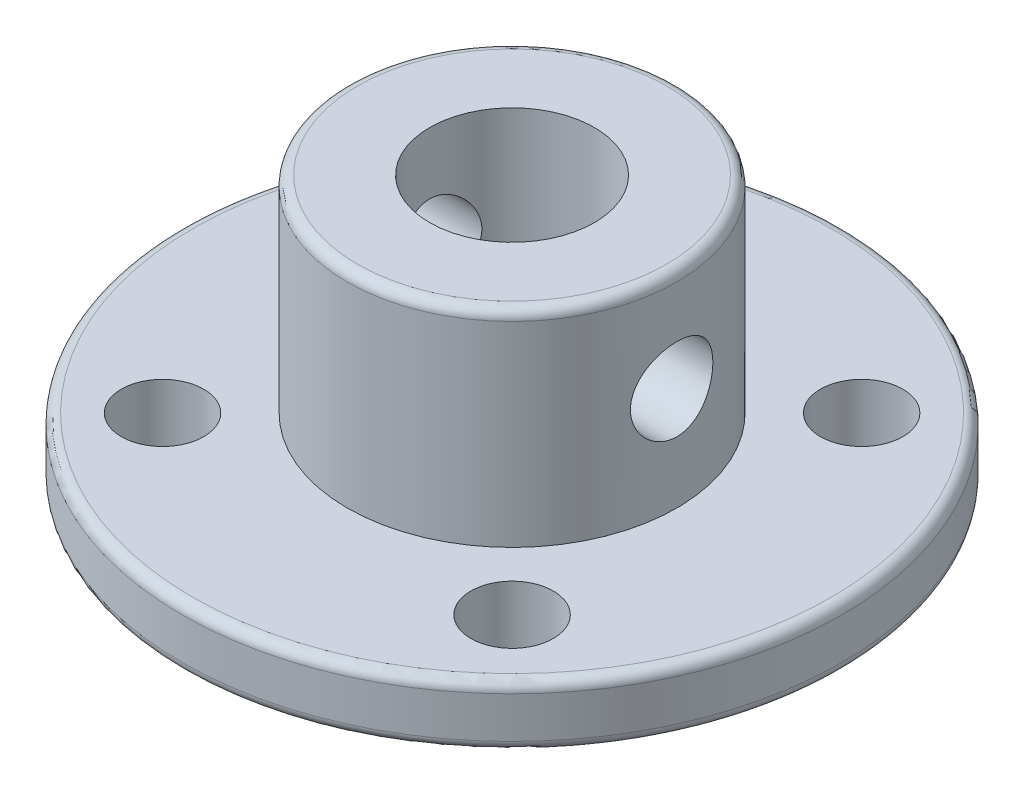
ISO-10303-21;
HEADER;
FILE_DESCRIPTION(('STEP AP214'),'2;1');
FILE_NAME('part.step','',(''),(''),'','','');
FILE_SCHEMA(('AUTOMOTIVE_DESIGN { 1 0 10303 214 1 1 1 1 }'));
ENDSEC;
DATA;
#1=APPLICATION_CONTEXT('core data for automotive mechanical design processes');
#2=APPLICATION_PROTOCOL_DEFINITION('international standard','automotive_design',2000,#1);
#3=PRODUCT_CONTEXT('',#1,'mechanical');
#4=PRODUCT('Part','Part','',(#3));
#5=PRODUCT_RELATED_PRODUCT_CATEGORY('part','',(#4));
#6=PRODUCT_DEFINITION_FORMATION('','',#4);
#7=PRODUCT_DEFINITION_CONTEXT('part definition',#1,'design');
#8=PRODUCT_DEFINITION('design','',#6,#7);
#9=PRODUCT_DEFINITION_SHAPE('','',#8);
#10=(LENGTH_UNIT() NAMED_UNIT(*) SI_UNIT(.MILLI.,.METRE.));
#11=(NAMED_UNIT(*) PLANE_ANGLE_UNIT() SI_UNIT($,.RADIAN.));
#12=(NAMED_UNIT(*) SI_UNIT($,.STERADIAN.) SOLID_ANGLE_UNIT());
#13=UNCERTAINTY_MEASURE_WITH_UNIT(LENGTH_MEASURE(1.E-05),#10,'distance_accuracy_value','');
#14=(GEOMETRIC_REPRESENTATION_CONTEXT(3) GLOBAL_UNCERTAINTY_ASSIGNED_CONTEXT((#13)) GLOBAL_UNIT_ASSIGNED_CONTEXT((#10,
#11,#12)) REPRESENTATION_CONTEXT('',''));
#15=CARTESIAN_POINT('',(0.,0.,0.));
#16=DIRECTION('',(0.,0.,1.));
#17=DIRECTION('',(1.,0.,0.));
#18=AXIS2_PLACEMENT_3D('',#15,#16,#17);
#19=CARTESIAN_POINT('',(0.,13.,0.));
#20=DIRECTION('',(0.,-1.,0.));
#21=DIRECTION('',(0.,0.,-1.));
#22=AXIS2_PLACEMENT_3D('',#19,#20,#21);
#23=CYLINDRICAL_SURFACE('',#22,8.);
#24=CARTESIAN_POINT('',(0.,12.5,0.));
#25=DIRECTION('',(0.,1.,0.));
#26=DIRECTION('',(0.,0.,1.));
#27=AXIS2_PLACEMENT_3D('',#24,#25,#26);
#28=CIRCLE('',#27,8.);
#29=CARTESIAN_POINT('',(0.,12.5,8.));
#30=VERTEX_POINT('',#29);
#31=EDGE_CURVE('E50',#30,#30,#28,.F.);
#32=ORIENTED_EDGE('',*,*,#31,.T.);
#33=EDGE_LOOP('',(#32));
#34=FACE_BOUND('',#33,.T.);
#35=CARTESIAN_POINT('',(0.,3.,0.));
#36=DIRECTION('',(0.,1.,0.));
#37=DIRECTION('',(0.,0.,1.));
#38=AXIS2_PLACEMENT_3D('',#35,#36,#37);
#39=CIRCLE('',#38,8.);
#40=CARTESIAN_POINT('',(0.,3.,8.));
#41=VERTEX_POINT('',#40);
#42=EDGE_CURVE('E69',#41,#41,#39,.T.);
#43=ORIENTED_EDGE('',*,*,#42,.T.);
#44=EDGE_LOOP('',(#43));
#45=FACE_BOUND('',#44,.T.);
#46=CARTESIAN_POINT('',(-7.74596669241483,8.,2.));
#47=CARTESIAN_POINT('',(-7.74596880070288,8.11044060074126,1.99999686287446));
#48=CARTESIAN_POINT('',(-7.74835444811678,8.22091591894282,1.99082099639812));
#49=CARTESIAN_POINT('',(-7.75761489594051,8.43869406253881,1.95441850037103));
#50=CARTESIAN_POINT('',(-7.76449230897304,8.54599500357455,1.92718136539368));
#51=CARTESIAN_POINT('',(-7.7819097967692,8.75424283054974,1.85559295970563));
#52=CARTESIAN_POINT('',(-7.79244514152366,8.85519772430857,1.81126378228359));
#53=CARTESIAN_POINT('',(-7.81598553623007,9.04824868203191,1.70681691300911));
#54=CARTESIAN_POINT('',(-7.82899069102791,9.14034436966417,1.64669855084855));
#55=CARTESIAN_POINT('',(-7.856325730845,9.31508931620977,1.5109667418495));
#56=CARTESIAN_POINT('',(-7.87067678098427,9.39751488028004,1.43506951016324));
#57=CARTESIAN_POINT('',(-7.89890300412235,9.54860911548827,1.27054565128053));
#58=CARTESIAN_POINT('',(-7.91277813253111,9.6172765004974,1.18191783534425));
#59=CARTESIAN_POINT('',(-7.93872332416466,9.73982037410502,0.992916160863164));
#60=CARTESIAN_POINT('',(-7.95076549920474,9.79347711052917,0.892395660956097));
#61=CARTESIAN_POINT('',(-7.97144649540787,9.88304771532247,0.683410547434211));
#62=CARTESIAN_POINT('',(-7.98008581867475,9.91896420153241,0.574947108633554));
#63=CARTESIAN_POINT('',(-7.99283807078544,9.97131826766287,0.355487007003331));
#64=CARTESIAN_POINT('',(-7.99703915075451,9.98813571546127,0.244586175639182));
#65=CARTESIAN_POINT('',(-8.00074875285838,10.0030067034204,0.0214630554102164));
#66=CARTESIAN_POINT('',(-8.00025796877363,10.0010630177677,-0.0907590356304541));
#67=CARTESIAN_POINT('',(-7.99470475962828,9.97874011979989,-0.310704494344773));
#68=CARTESIAN_POINT('',(-7.98974401872699,9.95877093995692,-0.418472431202132));
#69=CARTESIAN_POINT('',(-7.97592669219883,9.9016229839612,-0.629076494827371));
#70=CARTESIAN_POINT('',(-7.96706989918753,9.86444329169807,-0.731912358740875));
#71=CARTESIAN_POINT('',(-7.94630007760717,9.77359794345035,-0.930813407003612));
#72=CARTESIAN_POINT('',(-7.93436015756043,9.7197863642706,-1.02680901953301));
#73=CARTESIAN_POINT('',(-7.90871923047719,9.59731545670699,-1.20855124468098));
#74=CARTESIAN_POINT('',(-7.89501791721992,9.5286535451515,-1.29429607017101));
#75=CARTESIAN_POINT('',(-7.86690971015616,9.3762330064141,-1.45554807016991));
#76=CARTESIAN_POINT('',(-7.85249375620734,9.29211608612178,-1.5307153581504));
#77=CARTESIAN_POINT('',(-7.82492034813365,9.1123200211678,-1.66595275192604));
#78=CARTESIAN_POINT('',(-7.81176295284776,9.0166403364072,-1.72602215209203));
#79=CARTESIAN_POINT('',(-7.78816397465319,8.81576797268083,-1.82957625804519));
#80=CARTESIAN_POINT('',(-7.77773586980577,8.71053141574945,-1.87297913394098));
#81=CARTESIAN_POINT('',(-7.76094912111966,8.49393162553884,-1.94137124127268));
#82=CARTESIAN_POINT('',(-7.75458960648175,8.38256970881349,-1.96636441310582));
#83=CARTESIAN_POINT('',(-7.74684284831312,8.1600323987815,-1.99666371093214));
#84=CARTESIAN_POINT('',(-7.74532871274918,8.0489297653363,-2.0024723791357));
#85=CARTESIAN_POINT('',(-7.74709874784831,7.82734245073747,-1.99561359241244));
#86=CARTESIAN_POINT('',(-7.75038247681013,7.71685771363901,-1.98294783827904));
#87=CARTESIAN_POINT('',(-7.76125665563648,7.50150858803624,-1.93994037115013));
#88=CARTESIAN_POINT('',(-7.768775761875,7.39658181874333,-1.9098912546254));
#89=CARTESIAN_POINT('',(-7.7872057461677,7.19325483371866,-1.8332944653365));
#90=CARTESIAN_POINT('',(-7.79811702598891,7.09485539275573,-1.78674483817004));
#91=CARTESIAN_POINT('',(-7.8223690967461,6.90524697770612,-1.67741653434925));
#92=CARTESIAN_POINT('',(-7.83575334885313,6.81421692796552,-1.6143374030685));
#93=CARTESIAN_POINT('',(-7.86333666457373,6.64384930975892,-1.47412058586891));
#94=CARTESIAN_POINT('',(-7.87753586182776,6.56451366667994,-1.39698058961088));
#95=CARTESIAN_POINT('',(-7.90557922425285,6.41775116594324,-1.22852544196945));
#96=CARTESIAN_POINT('',(-7.91940561649468,6.35067194996095,-1.13690390506319));
#97=CARTESIAN_POINT('',(-7.94477773290987,6.23285130643901,-0.943405365389351));
#98=CARTESIAN_POINT('',(-7.95632357603169,6.18210902671344,-0.841528897915183));
#99=CARTESIAN_POINT('',(-7.9757609259065,6.09884317237765,-0.631116403462182));
#100=CARTESIAN_POINT('',(-7.98367864017925,6.06618857249675,-0.522634762055765));
#101=CARTESIAN_POINT('',(-7.99508234716634,6.01963173231327,-0.301499520637615));
#102=CARTESIAN_POINT('',(-7.99856919514738,6.00572587300877,-0.188846730082482));
#103=CARTESIAN_POINT('',(-8.00068338817612,5.99726482084892,0.0341670528866451));
#104=CARTESIAN_POINT('',(-7.99943957759977,6.00219658180918,0.144507653932042));
#105=CARTESIAN_POINT('',(-7.99251792914887,6.0300956545887,0.3627349928295));
#106=CARTESIAN_POINT('',(-7.98684022314338,6.05306243002634,0.470621803561856));
#107=CARTESIAN_POINT('',(-7.97170865707778,6.11610443954172,0.680342071289547));
#108=CARTESIAN_POINT('',(-7.96227529004785,6.15608690662876,0.782204989161725));
#109=CARTESIAN_POINT('',(-7.94062577827316,6.25194115803914,0.977834106083248));
#110=CARTESIAN_POINT('',(-7.92840928277515,6.30781494534097,1.07159928253127));
#111=CARTESIAN_POINT('',(-7.90214499360574,6.43543046799227,1.25080385684661));
#112=CARTESIAN_POINT('',(-7.88806033883329,6.50752028580766,1.33598997659667));
#113=CARTESIAN_POINT('',(-7.85981298114379,6.66484570395469,1.49323004054701));
#114=CARTESIAN_POINT('',(-7.84565025934604,6.75008463222232,1.56528065015318));
#115=CARTESIAN_POINT('',(-7.81854951691005,6.93320282837892,1.69552405294366));
#116=CARTESIAN_POINT('',(-7.80563927346578,7.03128824673051,1.75343323883276));
#117=CARTESIAN_POINT('',(-7.78287910989656,7.23611097974964,1.85185379317094));
#118=CARTESIAN_POINT('',(-7.77302696466427,7.34284193218769,1.8923778195043));
#119=CARTESIAN_POINT('',(-7.75903817501475,7.54115402367032,1.948845057142));
#120=CARTESIAN_POINT('',(-7.75417326006998,7.63178632877227,1.96798634119376));
#121=CARTESIAN_POINT('',(-7.7476367716524,7.81493773799538,1.99356458514354));
#122=CARTESIAN_POINT('',(-7.74596492578215,7.9074566804888,2.0000026287435));
#123=CARTESIAN_POINT('',(-7.74596669241483,8.,2.));
#124=B_SPLINE_CURVE_WITH_KNOTS('',3,(#46,#47,#48,#49,#50,#51,#52,#53,#54,#55,#56,#57,#58,#59,
#60,#61,#62,#63,#64,#65,#66,#67,#68,#69,#70,#71,#72,#73,#74,#75,#76,#77,#78,#79,#80,#81,#82,#83,
#84,#85,#86,#87,#88,#89,#90,#91,#92,#93,#94,#95,#96,#97,#98,#99,#100,#101,#102,#103,#104,#105,
#106,#107,#108,#109,#110,#111,#112,#113,#114,#115,#116,#117,#118,#119,#120,#121,#122,#123),
.UNSPECIFIED.,.T.,.F.,(4,2,2,2,2,2,2,2,2,2,2,2,2,2,2,2,2,2,2,2,2,2,2,2,2,2,2,2,2,2,2,2,2,2,2,2,
2,2,4),(0.,0.330981953388908,0.662156593142932,0.992904581732815,1.32366661404383,
1.66099163354381,1.99834817183893,2.34041197118336,2.68242527877674,3.01751000796277,
3.35254518932816,3.68014610151157,4.00776445379829,4.33834299403555,4.6689790837513,
5.00856373257529,5.34816424959841,5.68941145606722,6.03058560103638,6.36274859809374,
6.69488101747042,7.02157924007365,7.34831617137134,7.68146276687326,8.01466415108036,
8.35620264772255,8.69772332575643,9.03673658245543,9.3756843912723,9.70546756901965,
10.0352409390158,10.3632390124777,10.6912784459046,11.0271767726566,11.3631602525241,
11.7054118182895,12.0474137709606,12.3247826174462,12.6021278008238),.UNSPECIFIED.);
#125=CARTESIAN_POINT('',(-7.74596669241483,8.,2.));
#126=VERTEX_POINT('',#125);
#127=EDGE_CURVE('E79',#126,#126,#124,.T.);
#128=ORIENTED_EDGE('',*,*,#127,.F.);
#129=EDGE_LOOP('',(#128));
#130=FACE_BOUND('',#129,.T.);
#131=CARTESIAN_POINT('',(7.74596669241483,8.,2.));
#132=CARTESIAN_POINT('',(7.74596880070288,7.88955939925874,1.99999686287446));
#133=CARTESIAN_POINT('',(7.74835444811678,7.77908408105718,1.99082099639812));
#134=CARTESIAN_POINT('',(7.75761489594051,7.56130593746119,1.95441850037103));
#135=CARTESIAN_POINT('',(7.76449230897304,7.45400499642545,1.92718136539368));
#136=CARTESIAN_POINT('',(7.7819097967692,7.24575716945025,1.85559295970563));
#137=CARTESIAN_POINT('',(7.79244514152366,7.14480227569143,1.81126378228359));
#138=CARTESIAN_POINT('',(7.81598553623007,6.9517513179681,1.70681691300911));
#139=CARTESIAN_POINT('',(7.82899069102791,6.85965563033583,1.64669855084855));
#140=CARTESIAN_POINT('',(7.856325730845,6.68491068379023,1.51096674184951));
#141=CARTESIAN_POINT('',(7.87067678098427,6.60248511971996,1.43506951016324));
#142=CARTESIAN_POINT('',(7.89890300412235,6.45139088451173,1.27054565128053));
#143=CARTESIAN_POINT('',(7.91277813253111,6.3827234995026,1.18191783534425));
#144=CARTESIAN_POINT('',(7.93872332416466,6.26017962589498,0.992916160863165));
#145=CARTESIAN_POINT('',(7.95076549920474,6.20652288947083,0.892395660956097));
#146=CARTESIAN_POINT('',(7.97144649540787,6.11695228467753,0.683410547434211));
#147=CARTESIAN_POINT('',(7.98008581867475,6.08103579846759,0.574947108633553));
#148=CARTESIAN_POINT('',(7.99283807078544,6.02868173233713,0.355487007003329));
#149=CARTESIAN_POINT('',(7.99703915075451,6.01186428453873,0.24458617563918));
#150=CARTESIAN_POINT('',(8.00074875285838,5.99699329657956,0.0214630554102154));
#151=CARTESIAN_POINT('',(8.00025796877363,5.99893698223232,-0.0907590356304549));
#152=CARTESIAN_POINT('',(7.99470475962828,6.02125988020012,-0.310704494344775));
#153=CARTESIAN_POINT('',(7.98974401872699,6.04122906004308,-0.418472431202134));
#154=CARTESIAN_POINT('',(7.97592669219883,6.0983770160388,-0.629076494827372));
#155=CARTESIAN_POINT('',(7.96706989918753,6.13555670830193,-0.731912358740875));
#156=CARTESIAN_POINT('',(7.94630007760717,6.22640205654965,-0.930813407003613));
#157=CARTESIAN_POINT('',(7.93436015756043,6.2802136357294,-1.02680901953301));
#158=CARTESIAN_POINT('',(7.90871923047719,6.40268454329301,-1.20855124468098));
#159=CARTESIAN_POINT('',(7.89501791721992,6.4713464548485,-1.29429607017101));
#160=CARTESIAN_POINT('',(7.86690971015616,6.6237669935859,-1.45554807016991));
#161=CARTESIAN_POINT('',(7.85249375620734,6.70788391387822,-1.5307153581504));
#162=CARTESIAN_POINT('',(7.82492034813365,6.8876799788322,-1.66595275192604));
#163=CARTESIAN_POINT('',(7.81176295284776,6.9833596635928,-1.72602215209203));
#164=CARTESIAN_POINT('',(7.78816397465319,7.18423202731917,-1.8295762580452));
#165=CARTESIAN_POINT('',(7.77773586980577,7.28946858425056,-1.87297913394098));
#166=CARTESIAN_POINT('',(7.76094912111966,7.50606837446116,-1.94137124127268));
#167=CARTESIAN_POINT('',(7.75458960648175,7.61743029118651,-1.96636441310582));
#168=CARTESIAN_POINT('',(7.74684284831313,7.8399676012185,-1.99666371093214));
#169=CARTESIAN_POINT('',(7.74532871274919,7.9510702346637,-2.0024723791357));
#170=CARTESIAN_POINT('',(7.74709874784831,8.17265754926253,-1.99561359241244));
#171=CARTESIAN_POINT('',(7.75038247681013,8.28314228636099,-1.98294783827904));
#172=CARTESIAN_POINT('',(7.76125665563648,8.49849141196377,-1.93994037115013));
#173=CARTESIAN_POINT('',(7.768775761875,8.60341818125668,-1.9098912546254));
#174=CARTESIAN_POINT('',(7.7872057461677,8.80674516628135,-1.8332944653365));
#175=CARTESIAN_POINT('',(7.79811702598891,8.90514460724427,-1.78674483817004));
#176=CARTESIAN_POINT('',(7.8223690967461,9.09475302229388,-1.67741653434925));
#177=CARTESIAN_POINT('',(7.83575334885313,9.18578307203448,-1.6143374030685));
#178=CARTESIAN_POINT('',(7.86333666457373,9.35615069024108,-1.47412058586891));
#179=CARTESIAN_POINT('',(7.87753586182776,9.43548633332006,-1.39698058961088));
#180=CARTESIAN_POINT('',(7.90557922425285,9.58224883405677,-1.22852544196945));
#181=CARTESIAN_POINT('',(7.91940561649468,9.64932805003905,-1.13690390506318));
#182=CARTESIAN_POINT('',(7.94477773290987,9.76714869356099,-0.94340536538935));
#183=CARTESIAN_POINT('',(7.95632357603169,9.81789097328656,-0.841528897915181));
#184=CARTESIAN_POINT('',(7.9757609259065,9.90115682762235,-0.631116403462181));
#185=CARTESIAN_POINT('',(7.98367864017925,9.93381142750325,-0.522634762055765));
#186=CARTESIAN_POINT('',(7.99508234716634,9.98036826768673,-0.301499520637615));
#187=CARTESIAN_POINT('',(7.99856919514738,9.99427412699123,-0.188846730082481));
#188=CARTESIAN_POINT('',(8.00068338817612,10.0027351791511,0.0341670528866464));
#189=CARTESIAN_POINT('',(7.99943957759977,9.99780341819082,0.144507653932044));
#190=CARTESIAN_POINT('',(7.99251792914887,9.9699043454113,0.362734992829502));
#191=CARTESIAN_POINT('',(7.98684022314338,9.94693756997366,0.470621803561857));
#192=CARTESIAN_POINT('',(7.97170865707778,9.88389556045828,0.680342071289548));
#193=CARTESIAN_POINT('',(7.96227529004785,9.84391309337124,0.782204989161725));
#194=CARTESIAN_POINT('',(7.94062577827316,9.74805884196086,0.977834106083247));
#195=CARTESIAN_POINT('',(7.92840928277515,9.69218505465903,1.07159928253127));
#196=CARTESIAN_POINT('',(7.90214499360574,9.56456953200773,1.25080385684661));
#197=CARTESIAN_POINT('',(7.88806033883329,9.49247971419234,1.33598997659667));
#198=CARTESIAN_POINT('',(7.85981298114379,9.33515429604531,1.49323004054701));
#199=CARTESIAN_POINT('',(7.84565025934605,9.24991536777767,1.56528065015318));
#200=CARTESIAN_POINT('',(7.81854951691005,9.06679717162108,1.69552405294366));
#201=CARTESIAN_POINT('',(7.80563927346578,8.96871175326949,1.75343323883276));
#202=CARTESIAN_POINT('',(7.78287910989656,8.76388902025036,1.85185379317094));
#203=CARTESIAN_POINT('',(7.77302696466428,8.65715806781231,1.8923778195043));
#204=CARTESIAN_POINT('',(7.75903817501475,8.45884597632968,1.94884505714201));
#205=CARTESIAN_POINT('',(7.75417326006998,8.36821367122772,1.96798634119376));
#206=CARTESIAN_POINT('',(7.7476367716524,8.18506226200462,1.99356458514354));
#207=CARTESIAN_POINT('',(7.74596492578215,8.0925433195112,2.0000026287435));
#208=CARTESIAN_POINT('',(7.74596669241483,8.,2.));
#209=B_SPLINE_CURVE_WITH_KNOTS('',3,(#131,#132,#133,#134,#135,#136,#137,#138,#139,#140,#141,
#142,#143,#144,#145,#146,#147,#148,#149,#150,#151,#152,#153,#154,#155,#156,#157,#158,#159,#160,
#161,#162,#163,#164,#165,#166,#167,#168,#169,#170,#171,#172,#173,#174,#175,#176,#177,#178,#179,
#180,#181,#182,#183,#184,#185,#186,#187,#188,#189,#190,#191,#192,#193,#194,#195,#196,#197,#198,
#199,#200,#201,#202,#203,#204,#205,#206,#207,#208),.UNSPECIFIED.,.T.,.F.,(4,2,2,2,2,2,2,2,2,2,2,
2,2,2,2,2,2,2,2,2,2,2,2,2,2,2,2,2,2,2,2,2,2,2,2,2,2,2,4),(0.,0.330981953388909,
0.662156593142932,0.992904581732816,1.32366661404383,1.66099163354381,1.99834817183893,
2.34041197118336,2.68242527877674,3.01751000796277,3.35254518932816,3.68014610151158,
4.00776445379829,4.33834299403556,4.66897908375131,5.00856373257529,5.34816424959842,
5.68941145606722,6.03058560103638,6.36274859809374,6.69488101747042,7.02157924007366,
7.34831617137134,7.68146276687326,8.01466415108036,8.35620264772255,8.69772332575643,
9.03673658245543,9.37568439127231,9.70546756901966,10.0352409390158,10.3632390124777,
10.6912784459046,11.0271767726566,11.3631602525241,11.7054118182895,12.0474137709606,
12.3247826174462,12.6021278008238),.UNSPECIFIED.);
#210=CARTESIAN_POINT('',(7.74596669241483,8.,2.));
#211=VERTEX_POINT('',#210);
#212=EDGE_CURVE('E109',#211,#211,#209,.T.);
#213=ORIENTED_EDGE('',*,*,#212,.F.);
#214=EDGE_LOOP('',(#213));
#215=FACE_BOUND('',#214,.T.);
#216=ADVANCED_FACE('F37',(#34,#45,#130,#215),#23,.T.);
#217=CARTESIAN_POINT('',(0.,0.,0.));
#218=DIRECTION('',(0.,1.,0.));
#219=DIRECTION('',(0.,0.,1.));
#220=AXIS2_PLACEMENT_3D('',#217,#218,#219);
#221=CYLINDRICAL_SURFACE('',#220,4.);
#222=CARTESIAN_POINT('',(0.,0.,0.));
#223=DIRECTION('',(0.,1.,0.));
#224=DIRECTION('',(0.,0.,1.));
#225=AXIS2_PLACEMENT_3D('',#222,#223,#224);
#226=CIRCLE('',#225,4.);
#227=CARTESIAN_POINT('',(0.,0.,4.));
#228=VERTEX_POINT('',#227);
#229=EDGE_CURVE('E151',#228,#228,#226,.T.);
#230=ORIENTED_EDGE('',*,*,#229,.F.);
#231=EDGE_LOOP('',(#230));
#232=FACE_BOUND('',#231,.T.);
#233=CARTESIAN_POINT('',(0.,13.,0.));
#234=DIRECTION('',(0.,1.,0.));
#235=DIRECTION('',(0.,0.,1.));
#236=AXIS2_PLACEMENT_3D('',#233,#234,#235);
#237=CIRCLE('',#236,4.);
#238=CARTESIAN_POINT('',(0.,13.,4.));
#239=VERTEX_POINT('',#238);
#240=EDGE_CURVE('E148',#239,#239,#237,.T.);
#241=ORIENTED_EDGE('',*,*,#240,.T.);
#242=EDGE_LOOP('',(#241));
#243=FACE_BOUND('',#242,.T.);
#244=CARTESIAN_POINT('',(-3.46410161513776,8.,2.));
#245=CARTESIAN_POINT('',(-3.46411185715888,7.89578679452566,1.99999158748781));
#246=CARTESIAN_POINT('',(-3.46887633544978,7.7914378234662,1.99179963610437));
#247=CARTESIAN_POINT('',(-3.48724701669072,7.5859448227694,1.95944672580053));
#248=CARTESIAN_POINT('',(-3.50087179788183,7.48480799675224,1.93525221095662));
#249=CARTESIAN_POINT('',(-3.53498701490001,7.28909684355307,1.8721998159803));
#250=CARTESIAN_POINT('',(-3.55544089069169,7.19449074115075,1.83341988295963));
#251=CARTESIAN_POINT('',(-3.60085327291133,7.01315154952385,1.74253507245138));
#252=CARTESIAN_POINT('',(-3.62581202301253,6.92641888656323,1.69042947410139));
#253=CARTESIAN_POINT('',(-3.67993738819289,6.75538855686662,1.569333074538));
#254=CARTESIAN_POINT('',(-3.70928127465103,6.67188173240823,1.49930407053533));
#255=CARTESIAN_POINT('',(-3.76743965382121,6.5171832194294,1.34650761698202));
#256=CARTESIAN_POINT('',(-3.79625387610258,6.44599767379603,1.26373385204841));
#257=CARTESIAN_POINT('',(-3.85242953961661,6.3132656988115,1.08097912631265));
#258=CARTESIAN_POINT('',(-3.87956212851245,6.25269246457669,0.980214377887153));
#259=CARTESIAN_POINT('',(-3.92701512184167,6.14971829321291,0.768314053336917));
#260=CARTESIAN_POINT('',(-3.94733982363631,6.1073058876492,0.657185076311985));
#261=CARTESIAN_POINT('',(-3.97760922492053,6.04499067746882,0.436089887818817));
#262=CARTESIAN_POINT('',(-3.9881896044274,6.0237009473079,0.326603580968785));
#263=CARTESIAN_POINT('',(-4.00015167691179,5.99966776263097,0.10514125740454));
#264=CARTESIAN_POINT('',(-4.00153893568935,5.99691308640372,-0.00683321168520826));
#265=CARTESIAN_POINT('',(-3.99525963833124,6.00949334794514,-0.219665048849573));
#266=CARTESIAN_POINT('',(-3.98836991784381,6.02327603104364,-0.320642398354139));
#267=CARTESIAN_POINT('',(-3.96748490519435,6.06576168780812,-0.518627543836089));
#268=CARTESIAN_POINT('',(-3.95348908132771,6.09446577795212,-0.615635042187702));
#269=CARTESIAN_POINT('',(-3.91943166575325,6.16616513217995,-0.80461878313926));
#270=CARTESIAN_POINT('',(-3.89928883058403,6.20935262634422,-0.896506847030398));
#271=CARTESIAN_POINT('',(-3.8547529197337,6.3085268324029,-1.07195360302662));
#272=CARTESIAN_POINT('',(-3.83035832314967,6.36451812660468,-1.15550929767728));
#273=CARTESIAN_POINT('',(-3.7768878879846,6.49379070306606,-1.3203473217964));
#274=CARTESIAN_POINT('',(-3.7475875199635,6.56820605665203,-1.40066815005872));
#275=CARTESIAN_POINT('',(-3.68908681173623,6.72917944986035,-1.54820874059556));
#276=CARTESIAN_POINT('',(-3.65988656531258,6.81574674454812,-1.61541842314846));
#277=CARTESIAN_POINT('',(-3.60288312184969,7.00529638484818,-1.73901066928442));
#278=CARTESIAN_POINT('',(-3.57528639981415,7.10897204610842,-1.7944346299561));
#279=CARTESIAN_POINT('',(-3.52750900557152,7.325875342718,-1.88663822600246));
#280=CARTESIAN_POINT('',(-3.50732060092135,7.43909286603513,-1.92343731642178));
#281=CARTESIAN_POINT('',(-3.47889271634069,7.66242902256558,-1.97436042205008));
#282=CARTESIAN_POINT('',(-3.46983311696993,7.7720822380871,-1.99005024423995));
#283=CARTESIAN_POINT('',(-3.46235838723219,7.99280268303309,-2.00303389322285));
#284=CARTESIAN_POINT('',(-3.46393573778623,8.1038688582396,-2.00034071463005));
#285=CARTESIAN_POINT('',(-3.4766867308117,8.31130783715744,-1.97807208668793));
#286=CARTESIAN_POINT('',(-3.48679175013308,8.40795890221579,-1.96037563342492));
#287=CARTESIAN_POINT('',(-3.51388043102682,8.59673557254199,-1.91139256926489));
#288=CARTESIAN_POINT('',(-3.53086632010068,8.68885970149348,-1.88010155724727));
#289=CARTESIAN_POINT('',(-3.57072444159313,8.87082266180511,-1.80329517720973));
#290=CARTESIAN_POINT('',(-3.59383286486126,8.96035803370605,-1.7571881273853));
#291=CARTESIAN_POINT('',(-3.643122389945,9.13093854307904,-1.65257412803176));
#292=CARTESIAN_POINT('',(-3.66930506710298,9.21197928703051,-1.59406080866498));
#293=CARTESIAN_POINT('',(-3.72575996912669,9.37395753504266,-1.45767433439708));
#294=CARTESIAN_POINT('',(-3.75613166308566,9.45359430141778,-1.37829054462747));
#295=CARTESIAN_POINT('',(-3.81468469955797,9.59882447600473,-1.20680899079903));
#296=CARTESIAN_POINT('',(-3.84286530015463,9.66441314052684,-1.11470694931991));
#297=CARTESIAN_POINT('',(-3.89482723381868,9.78114745183271,-0.917070725108057));
#298=CARTESIAN_POINT('',(-3.91847283343884,9.83186623616677,-0.811246195112493));
#299=CARTESIAN_POINT('',(-3.95766709918776,9.91427580796961,-0.591044729317864));
#300=CARTESIAN_POINT('',(-3.97322287353397,9.9459833036841,-0.476675402917652));
#301=CARTESIAN_POINT('',(-3.99335016363174,9.98673712748514,-0.253959364539763));
#302=CARTESIAN_POINT('',(-3.9987985581427,9.99759574866428,-0.146022887268299));
#303=CARTESIAN_POINT('',(-4.00084260752374,10.0016865339957,0.0702519714699463));
#304=CARTESIAN_POINT('',(-3.99744136141634,9.99492486852887,0.178590198981615));
#305=CARTESIAN_POINT('',(-3.98267937668509,9.96516717568359,0.38507598613686));
#306=CARTESIAN_POINT('',(-3.97185789309443,9.94327026269095,0.48342464105742));
#307=CARTESIAN_POINT('',(-3.94384187353387,9.88534604019333,0.674891898931566));
#308=CARTESIAN_POINT('',(-3.92664642364424,9.84931670429309,0.768009749669773));
#309=CARTESIAN_POINT('',(-3.8865186139318,9.7625457450086,0.950846833596742));
#310=CARTESIAN_POINT('',(-3.86337234005404,9.71124078024814,1.0402503657229));
#311=CARTESIAN_POINT('',(-3.81376266676027,9.59608471188191,1.20954920326828));
#312=CARTESIAN_POINT('',(-3.78729774583427,9.53222784589843,1.28944011444319));
#313=CARTESIAN_POINT('',(-3.73057218840582,9.38640336444059,1.44582833859495));
#314=CARTESIAN_POINT('',(-3.70019591726075,9.30326581919971,1.52119665879199));
#315=CARTESIAN_POINT('',(-3.64126158628571,9.12510777169391,1.65732528394006));
#316=CARTESIAN_POINT('',(-3.61270515130784,9.03007686863948,1.71807266521244));
#317=CARTESIAN_POINT('',(-3.55999186256751,8.82669110586976,1.82486714716811));
#318=CARTESIAN_POINT('',(-3.53600256268535,8.71801008926472,1.87038902381914));
#319=CARTESIAN_POINT('',(-3.5069621813237,8.54942188036905,1.92395929504801));
#320=CARTESIAN_POINT('',(-3.49844389329401,8.49235217940932,1.93935666147967));
#321=CARTESIAN_POINT('',(-3.48406059323535,8.37676744249981,1.96508069805043));
#322=CARTESIAN_POINT('',(-3.47819372636051,8.31825344724575,1.97541091343282));
#323=CARTESIAN_POINT('',(-3.47059023668758,8.21639921075271,1.9887293296122));
#324=CARTESIAN_POINT('',(-3.46816389731815,8.17326694274993,1.99295091983786));
#325=CARTESIAN_POINT('',(-3.46491740045177,8.0867643069071,1.99858810035606));
#326=CARTESIAN_POINT('',(-3.46409735040492,8.0433939233333,2.00000350293331));
#327=CARTESIAN_POINT('',(-3.46410161513776,8.,2.));
#328=B_SPLINE_CURVE_WITH_KNOTS('',3,(#244,#245,#246,#247,#248,#249,#250,#251,#252,#253,#254,
#255,#256,#257,#258,#259,#260,#261,#262,#263,#264,#265,#266,#267,#268,#269,#270,#271,#272,#273,
#274,#275,#276,#277,#278,#279,#280,#281,#282,#283,#284,#285,#286,#287,#288,#289,#290,#291,#292,
#293,#294,#295,#296,#297,#298,#299,#300,#301,#302,#303,#304,#305,#306,#307,#308,#309,#310,#311,
#312,#313,#314,#315,#316,#317,#318,#319,#320,#321,#322,#323,#324,#325,#326,#327),.UNSPECIFIED.,
.T.,.F.,(4,2,2,2,2,2,2,2,2,2,2,2,2,2,2,2,2,2,2,2,2,2,2,2,2,2,2,2,2,2,2,2,2,2,2,2,2,2,2,2,2,4),
(0.,0.312464245189431,0.625585785649609,0.937057191861536,1.24854545093096,1.58572462503713,
1.92307142172809,2.28315784481593,2.64301653931849,2.97726969939937,3.31132047376147,
3.61632194973143,3.92134625038977,4.2305906946636,4.5399459870461,4.87854382917848,
5.21740096495904,5.57777683462963,5.93777548427477,6.2692458171249,6.60048186380813,
6.89548366852118,7.19058104876193,7.49934592816242,7.80826972444162,8.15613487165293,
8.50411729960471,8.86128362829998,9.2181355962161,9.5422454078304,9.8662417359201,
10.1688884974705,10.4715786702809,10.7872150144301,11.102996602055,11.450204837042,
11.7977188569437,12.1562149808128,12.3351395323571,12.5139387197526,12.6440387634036,
12.7741475095882),.UNSPECIFIED.);
#329=CARTESIAN_POINT('',(-3.46410161513776,8.,2.));
#330=VERTEX_POINT('',#329);
#331=EDGE_CURVE('E80',#330,#330,#328,.T.);
#332=ORIENTED_EDGE('',*,*,#331,.F.);
#333=EDGE_LOOP('',(#332));
#334=FACE_BOUND('',#333,.T.);
#335=CARTESIAN_POINT('',(3.46410161513775,8.,2.));
#336=CARTESIAN_POINT('',(3.46411185715887,8.10421320547434,1.99999158748781));
#337=CARTESIAN_POINT('',(3.46887633544978,8.2085621765338,1.99179963610437));
#338=CARTESIAN_POINT('',(3.48724701669072,8.4140551772306,1.95944672580053));
#339=CARTESIAN_POINT('',(3.50087179788183,8.51519200324776,1.93525221095662));
#340=CARTESIAN_POINT('',(3.53498701490001,8.71090315644693,1.8721998159803));
#341=CARTESIAN_POINT('',(3.55544089069169,8.80550925884925,1.83341988295963));
#342=CARTESIAN_POINT('',(3.60085327291133,8.98684845047615,1.74253507245138));
#343=CARTESIAN_POINT('',(3.62581202301253,9.07358111343677,1.69042947410139));
#344=CARTESIAN_POINT('',(3.67993738819289,9.24461144313338,1.569333074538));
#345=CARTESIAN_POINT('',(3.70928127465103,9.32811826759177,1.49930407053533));
#346=CARTESIAN_POINT('',(3.76743965382121,9.4828167805706,1.34650761698202));
#347=CARTESIAN_POINT('',(3.79625387610258,9.55400232620397,1.26373385204841));
#348=CARTESIAN_POINT('',(3.85242953961661,9.6867343011885,1.08097912631265));
#349=CARTESIAN_POINT('',(3.87956212851245,9.74730753542331,0.980214377887154));
#350=CARTESIAN_POINT('',(3.92701512184167,9.85028170678709,0.768314053336918));
#351=CARTESIAN_POINT('',(3.94733982363631,9.8926941123508,0.657185076311987));
#352=CARTESIAN_POINT('',(3.97760922492053,9.95500932253118,0.436089887818818));
#353=CARTESIAN_POINT('',(3.98818960442739,9.9762990526921,0.326603580968786));
#354=CARTESIAN_POINT('',(4.00015167691179,10.000332237369,0.105141257404541));
#355=CARTESIAN_POINT('',(4.00153893568935,10.0030869135963,-0.00683321168520675));
#356=CARTESIAN_POINT('',(3.99525963833124,9.99050665205486,-0.219665048849571));
#357=CARTESIAN_POINT('',(3.98836991784381,9.97672396895636,-0.320642398354138));
#358=CARTESIAN_POINT('',(3.96748490519435,9.93423831219188,-0.518627543836088));
#359=CARTESIAN_POINT('',(3.95348908132771,9.90553422204787,-0.615635042187701));
#360=CARTESIAN_POINT('',(3.91943166575325,9.83383486782005,-0.804618783139259));
#361=CARTESIAN_POINT('',(3.89928883058403,9.79064737365578,-0.896506847030398));
#362=CARTESIAN_POINT('',(3.8547529197337,9.6914731675971,-1.07195360302662));
#363=CARTESIAN_POINT('',(3.83035832314967,9.63548187339533,-1.15550929767728));
#364=CARTESIAN_POINT('',(3.7768878879846,9.50620929693394,-1.3203473217964));
#365=CARTESIAN_POINT('',(3.74758751996351,9.43179394334797,-1.40066815005872));
#366=CARTESIAN_POINT('',(3.68908681173623,9.27082055013966,-1.54820874059556));
#367=CARTESIAN_POINT('',(3.65988656531258,9.18425325545188,-1.61541842314846));
#368=CARTESIAN_POINT('',(3.60288312184969,8.99470361515182,-1.73901066928442));
#369=CARTESIAN_POINT('',(3.57528639981415,8.89102795389158,-1.7944346299561));
#370=CARTESIAN_POINT('',(3.52750900557152,8.67412465728201,-1.88663822600246));
#371=CARTESIAN_POINT('',(3.50732060092135,8.56090713396488,-1.92343731642178));
#372=CARTESIAN_POINT('',(3.47889271634069,8.33757097743442,-1.97436042205008));
#373=CARTESIAN_POINT('',(3.46983311696993,8.2279177619129,-1.99005024423995));
#374=CARTESIAN_POINT('',(3.46235838723219,8.00719731696691,-2.00303389322285));
#375=CARTESIAN_POINT('',(3.46393573778623,7.8961311417604,-2.00034071463005));
#376=CARTESIAN_POINT('',(3.4766867308117,7.68869216284257,-1.97807208668793));
#377=CARTESIAN_POINT('',(3.48679175013308,7.59204109778422,-1.96037563342492));
#378=CARTESIAN_POINT('',(3.51388043102682,7.40326442745801,-1.91139256926489));
#379=CARTESIAN_POINT('',(3.53086632010068,7.31114029850652,-1.88010155724727));
#380=CARTESIAN_POINT('',(3.57072444159313,7.12917733819489,-1.80329517720973));
#381=CARTESIAN_POINT('',(3.59383286486126,7.03964196629395,-1.7571881273853));
#382=CARTESIAN_POINT('',(3.643122389945,6.86906145692096,-1.65257412803176));
#383=CARTESIAN_POINT('',(3.66930506710298,6.78802071296949,-1.59406080866499));
#384=CARTESIAN_POINT('',(3.72575996912669,6.62604246495734,-1.45767433439709));
#385=CARTESIAN_POINT('',(3.75613166308566,6.54640569858222,-1.37829054462748));
#386=CARTESIAN_POINT('',(3.81468469955797,6.40117552399527,-1.20680899079904));
#387=CARTESIAN_POINT('',(3.84286530015463,6.33558685947316,-1.11470694931991));
#388=CARTESIAN_POINT('',(3.89482723381867,6.21885254816729,-0.917070725108059));
#389=CARTESIAN_POINT('',(3.91847283343884,6.16813376383323,-0.811246195112495));
#390=CARTESIAN_POINT('',(3.95766709918776,6.08572419203039,-0.591044729317866));
#391=CARTESIAN_POINT('',(3.97322287353397,6.0540166963159,-0.476675402917653));
#392=CARTESIAN_POINT('',(3.99335016363174,6.01326287251486,-0.253959364539764));
#393=CARTESIAN_POINT('',(3.9987985581427,6.00240425133572,-0.1460228872683));
#394=CARTESIAN_POINT('',(4.00084260752374,5.99831346600433,0.0702519714699451));
#395=CARTESIAN_POINT('',(3.99744136141634,6.00507513147113,0.178590198981613));
#396=CARTESIAN_POINT('',(3.98267937668509,6.0348328243164,0.385075986136858));
#397=CARTESIAN_POINT('',(3.97185789309443,6.05672973730905,0.483424641057418));
#398=CARTESIAN_POINT('',(3.94384187353387,6.11465395980667,0.674891898931564));
#399=CARTESIAN_POINT('',(3.92664642364424,6.15068329570691,0.768009749669771));
#400=CARTESIAN_POINT('',(3.8865186139318,6.2374542549914,0.95084683359674));
#401=CARTESIAN_POINT('',(3.86337234005404,6.28875921975186,1.0402503657229));
#402=CARTESIAN_POINT('',(3.81376266676027,6.40391528811809,1.20954920326828));
#403=CARTESIAN_POINT('',(3.78729774583427,6.46777215410157,1.28944011444319));
#404=CARTESIAN_POINT('',(3.73057218840582,6.61359663555941,1.44582833859495));
#405=CARTESIAN_POINT('',(3.70019591726075,6.69673418080028,1.52119665879199));
#406=CARTESIAN_POINT('',(3.64126158628571,6.87489222830609,1.65732528394006));
#407=CARTESIAN_POINT('',(3.61270515130784,6.96992313136052,1.71807266521244));
#408=CARTESIAN_POINT('',(3.55999186256751,7.17330889413024,1.82486714716811));
#409=CARTESIAN_POINT('',(3.53600256268535,7.28198991073527,1.87038902381914));
#410=CARTESIAN_POINT('',(3.5069621813237,7.45057811963094,1.92395929504801));
#411=CARTESIAN_POINT('',(3.49844389329401,7.50764782059068,1.93935666147967));
#412=CARTESIAN_POINT('',(3.48406059323535,7.62323255750019,1.96508069805043));
#413=CARTESIAN_POINT('',(3.47819372636051,7.68174655275425,1.97541091343282));
#414=CARTESIAN_POINT('',(3.47059023668758,7.78360078924729,1.9887293296122));
#415=CARTESIAN_POINT('',(3.46816389731816,7.82673305725007,1.99295091983786));
#416=CARTESIAN_POINT('',(3.46491740045177,7.9132356930929,1.99858810035606));
#417=CARTESIAN_POINT('',(3.46409735040492,7.9566060766667,2.00000350293331));
#418=CARTESIAN_POINT('',(3.46410161513775,8.,2.));
#419=B_SPLINE_CURVE_WITH_KNOTS('',3,(#335,#336,#337,#338,#339,#340,#341,#342,#343,#344,#345,
#346,#347,#348,#349,#350,#351,#352,#353,#354,#355,#356,#357,#358,#359,#360,#361,#362,#363,#364,
#365,#366,#367,#368,#369,#370,#371,#372,#373,#374,#375,#376,#377,#378,#379,#380,#381,#382,#383,
#384,#385,#386,#387,#388,#389,#390,#391,#392,#393,#394,#395,#396,#397,#398,#399,#400,#401,#402,
#403,#404,#405,#406,#407,#408,#409,#410,#411,#412,#413,#414,#415,#416,#417,#418),.UNSPECIFIED.,
.T.,.F.,(4,2,2,2,2,2,2,2,2,2,2,2,2,2,2,2,2,2,2,2,2,2,2,2,2,2,2,2,2,2,2,2,2,2,2,2,2,2,2,2,2,4),
(0.,0.312464245189432,0.62558578564961,0.937057191861534,1.24854545093096,1.58572462503713,
1.92307142172808,2.28315784481593,2.64301653931849,2.97726969939937,3.31132047376147,
3.61632194973143,3.92134625038977,4.2305906946636,4.5399459870461,4.87854382917848,
5.21740096495904,5.57777683462963,5.93777548427476,6.2692458171249,6.60048186380812,
6.89548366852117,7.19058104876193,7.49934592816242,7.80826972444161,8.15613487165293,
8.50411729960471,8.86128362829998,9.2181355962161,9.5422454078304,9.8662417359201,
10.1688884974705,10.4715786702809,10.7872150144301,11.102996602055,11.450204837042,
11.7977188569437,12.1562149808128,12.3351395323571,12.5139387197526,12.6440387634036,
12.7741475095882),.UNSPECIFIED.);
#420=CARTESIAN_POINT('',(3.46410161513775,8.,2.));
#421=VERTEX_POINT('',#420);
#422=EDGE_CURVE('E70',#421,#421,#419,.T.);
#423=ORIENTED_EDGE('',*,*,#422,.F.);
#424=EDGE_LOOP('',(#423));
#425=FACE_BOUND('',#424,.T.);
#426=ADVANCED_FACE('F85',(#232,#243,#334,#425),#221,.F.);
#427=CARTESIAN_POINT('',(0.,3.,0.));
#428=DIRECTION('',(0.,-1.,0.));
#429=DIRECTION('',(0.,0.,-1.));
#430=AXIS2_PLACEMENT_3D('',#427,#428,#429);
#431=CYLINDRICAL_SURFACE('',#430,16.);
#432=CARTESIAN_POINT('',(0.,2.5,0.));
#433=DIRECTION('',(0.,1.,0.));
#434=DIRECTION('',(0.,0.,1.));
#435=AXIS2_PLACEMENT_3D('',#432,#433,#434);
#436=CIRCLE('',#435,16.);
#437=CARTESIAN_POINT('',(0.,2.5,16.));
#438=VERTEX_POINT('',#437);
#439=EDGE_CURVE('E10',#438,#438,#436,.F.);
#440=ORIENTED_EDGE('',*,*,#439,.T.);
#441=EDGE_LOOP('',(#440));
#442=FACE_BOUND('',#441,.T.);
#443=CARTESIAN_POINT('',(0.,0.5,0.));
#444=DIRECTION('',(0.,1.,0.));
#445=DIRECTION('',(0.,0.,1.));
#446=AXIS2_PLACEMENT_3D('',#443,#444,#445);
#447=CIRCLE('',#446,16.);
#448=CARTESIAN_POINT('',(0.,0.5,16.));
#449=VERTEX_POINT('',#448);
#450=EDGE_CURVE('E65',#449,#449,#447,.T.);
#451=ORIENTED_EDGE('',*,*,#450,.T.);
#452=EDGE_LOOP('',(#451));
#453=FACE_BOUND('',#452,.T.);
#454=ADVANCED_FACE('F124',(#442,#453),#431,.T.);
#455=CARTESIAN_POINT('',(0.,3.,0.));
#456=DIRECTION('',(0.,1.,0.));
#457=DIRECTION('',(0.,0.,1.));
#458=AXIS2_PLACEMENT_3D('',#455,#456,#457);
#459=PLANE('',#458);
#460=CARTESIAN_POINT('',(0.,3.,0.));
#461=DIRECTION('',(0.,1.,0.));
#462=DIRECTION('',(0.,0.,1.));
#463=AXIS2_PLACEMENT_3D('',#460,#461,#462);
#464=CIRCLE('',#463,15.5);
#465=CARTESIAN_POINT('',(0.,3.,15.5));
#466=VERTEX_POINT('',#465);
#467=EDGE_CURVE('E45',#466,#466,#464,.T.);
#468=ORIENTED_EDGE('',*,*,#467,.T.);
#469=EDGE_LOOP('',(#468));
#470=FACE_BOUND('',#469,.T.);
#471=CARTESIAN_POINT('',(-8.48528137423859,3.,-8.48528137423808));
#472=DIRECTION('',(0.,1.,0.));
#473=DIRECTION('',(0.,0.,1.));
#474=AXIS2_PLACEMENT_3D('',#471,#472,#473);
#475=CIRCLE('',#474,2.00000000000051);
#476=CARTESIAN_POINT('',(-8.48528137423859,3.,-6.48528137423757));
#477=VERTEX_POINT('',#476);
#478=EDGE_CURVE('E174',#477,#477,#475,.T.);
#479=ORIENTED_EDGE('',*,*,#478,.F.);
#480=EDGE_LOOP('',(#479));
#481=FACE_BOUND('',#480,.T.);
#482=CARTESIAN_POINT('',(-8.48528137423809,3.,8.48528137423906));
#483=DIRECTION('',(0.,1.,0.));
#484=DIRECTION('',(0.,0.,1.));
#485=AXIS2_PLACEMENT_3D('',#482,#483,#484);
#486=CIRCLE('',#485,2.00000000000035);
#487=CARTESIAN_POINT('',(-8.48528137423809,3.,10.4852813742394));
#488=VERTEX_POINT('',#487);
#489=EDGE_CURVE('E183',#488,#488,#486,.T.);
#490=ORIENTED_EDGE('',*,*,#489,.F.);
#491=EDGE_LOOP('',(#490));
#492=FACE_BOUND('',#491,.T.);
#493=CARTESIAN_POINT('',(8.48528137423906,3.,8.48528137423855));
#494=DIRECTION('',(0.,1.,0.));
#495=DIRECTION('',(0.,0.,1.));
#496=AXIS2_PLACEMENT_3D('',#493,#494,#495);
#497=CIRCLE('',#496,1.99999999999988);
#498=CARTESIAN_POINT('',(8.48528137423906,3.,10.4852813742384));
#499=VERTEX_POINT('',#498);
#500=EDGE_CURVE('E193',#499,#499,#497,.T.);
#501=ORIENTED_EDGE('',*,*,#500,.F.);
#502=EDGE_LOOP('',(#501));
#503=FACE_BOUND('',#502,.T.);
#504=CARTESIAN_POINT('',(8.48528137423856,3.,-8.48528137423859));
#505=DIRECTION('',(0.,1.,0.));
#506=DIRECTION('',(0.,0.,1.));
#507=AXIS2_PLACEMENT_3D('',#504,#505,#506);
#508=CIRCLE('',#507,2.);
#509=CARTESIAN_POINT('',(8.48528137423856,3.,-6.48528137423859));
#510=VERTEX_POINT('',#509);
#511=EDGE_CURVE('E159',#510,#510,#508,.T.);
#512=ORIENTED_EDGE('',*,*,#511,.F.);
#513=EDGE_LOOP('',(#512));
#514=FACE_BOUND('',#513,.T.);
#515=ORIENTED_EDGE('',*,*,#42,.F.);
#516=EDGE_LOOP('',(#515));
#517=FACE_BOUND('',#516,.T.);
#518=ADVANCED_FACE('F119',(#470,#481,#492,#503,#514,#517),#459,.T.);
#519=CARTESIAN_POINT('',(0.,0.,0.));
#520=DIRECTION('',(0.,1.,0.));
#521=DIRECTION('',(0.,0.,1.));
#522=AXIS2_PLACEMENT_3D('',#519,#520,#521);
#523=PLANE('',#522);
#524=CARTESIAN_POINT('',(0.,0.,0.));
#525=DIRECTION('',(0.,1.,0.));
#526=DIRECTION('',(0.,0.,1.));
#527=AXIS2_PLACEMENT_3D('',#524,#525,#526);
#528=CIRCLE('',#527,15.5);
#529=CARTESIAN_POINT('',(0.,0.,15.5));
#530=VERTEX_POINT('',#529);
#531=EDGE_CURVE('E61',#530,#530,#528,.F.);
#532=ORIENTED_EDGE('',*,*,#531,.T.);
#533=EDGE_LOOP('',(#532));
#534=FACE_BOUND('',#533,.T.);
#535=CARTESIAN_POINT('',(-8.48528137423859,0.,-8.48528137423808));
#536=DIRECTION('',(0.,1.,0.));
#537=DIRECTION('',(0.,0.,1.));
#538=AXIS2_PLACEMENT_3D('',#535,#536,#537);
#539=CIRCLE('',#538,2.00000000000051);
#540=CARTESIAN_POINT('',(-8.48528137423859,0.,-6.48528137423757));
#541=VERTEX_POINT('',#540);
#542=EDGE_CURVE('E177',#541,#541,#539,.T.);
#543=ORIENTED_EDGE('',*,*,#542,.T.);
#544=EDGE_LOOP('',(#543));
#545=FACE_BOUND('',#544,.T.);
#546=CARTESIAN_POINT('',(-8.48528137423809,0.,8.48528137423906));
#547=DIRECTION('',(0.,1.,0.));
#548=DIRECTION('',(0.,0.,1.));
#549=AXIS2_PLACEMENT_3D('',#546,#547,#548);
#550=CIRCLE('',#549,2.00000000000035);
#551=CARTESIAN_POINT('',(-8.48528137423809,0.,10.4852813742394));
#552=VERTEX_POINT('',#551);
#553=EDGE_CURVE('E198',#552,#552,#550,.T.);
#554=ORIENTED_EDGE('',*,*,#553,.T.);
#555=EDGE_LOOP('',(#554));
#556=FACE_BOUND('',#555,.T.);
#557=CARTESIAN_POINT('',(8.48528137423906,0.,8.48528137423855));
#558=DIRECTION('',(0.,1.,0.));
#559=DIRECTION('',(0.,0.,1.));
#560=AXIS2_PLACEMENT_3D('',#557,#558,#559);
#561=CIRCLE('',#560,1.99999999999988);
#562=CARTESIAN_POINT('',(8.48528137423906,0.,10.4852813742384));
#563=VERTEX_POINT('',#562);
#564=EDGE_CURVE('E188',#563,#563,#561,.T.);
#565=ORIENTED_EDGE('',*,*,#564,.T.);
#566=EDGE_LOOP('',(#565));
#567=FACE_BOUND('',#566,.T.);
#568=CARTESIAN_POINT('',(8.48528137423856,0.,-8.48528137423859));
#569=DIRECTION('',(0.,1.,0.));
#570=DIRECTION('',(0.,0.,1.));
#571=AXIS2_PLACEMENT_3D('',#568,#569,#570);
#572=CIRCLE('',#571,2.);
#573=CARTESIAN_POINT('',(8.48528137423856,0.,-6.48528137423859));
#574=VERTEX_POINT('',#573);
#575=EDGE_CURVE('E152',#574,#574,#572,.T.);
#576=ORIENTED_EDGE('',*,*,#575,.T.);
#577=EDGE_LOOP('',(#576));
#578=FACE_BOUND('',#577,.T.);
#579=ORIENTED_EDGE('',*,*,#229,.T.);
#580=EDGE_LOOP('',(#579));
#581=FACE_BOUND('',#580,.T.);
#582=ADVANCED_FACE('F123',(#534,#545,#556,#567,#578,#581),#523,.F.);
#583=CARTESIAN_POINT('',(0.,13.,0.));
#584=DIRECTION('',(0.,1.,0.));
#585=DIRECTION('',(0.,0.,1.));
#586=AXIS2_PLACEMENT_3D('',#583,#584,#585);
#587=PLANE('',#586);
#588=CARTESIAN_POINT('',(0.,13.,0.));
#589=DIRECTION('',(0.,1.,0.));
#590=DIRECTION('',(0.,0.,1.));
#591=AXIS2_PLACEMENT_3D('',#588,#589,#590);
#592=CIRCLE('',#591,7.5);
#593=CARTESIAN_POINT('',(0.,13.,7.5));
#594=VERTEX_POINT('',#593);
#595=EDGE_CURVE('E55',#594,#594,#592,.T.);
#596=ORIENTED_EDGE('',*,*,#595,.T.);
#597=EDGE_LOOP('',(#596));
#598=FACE_BOUND('',#597,.T.);
#599=ORIENTED_EDGE('',*,*,#240,.F.);
#600=EDGE_LOOP('',(#599));
#601=FACE_BOUND('',#600,.T.);
#602=ADVANCED_FACE('F118',(#598,#601),#587,.T.);
#603=CARTESIAN_POINT('',(8.48528137423856,0.,-8.48528137423859));
#604=DIRECTION('',(0.,1.,0.));
#605=DIRECTION('',(0.,0.,1.));
#606=AXIS2_PLACEMENT_3D('',#603,#604,#605);
#607=CYLINDRICAL_SURFACE('',#606,2.);
#608=ORIENTED_EDGE('',*,*,#575,.F.);
#609=EDGE_LOOP('',(#608));
#610=FACE_BOUND('',#609,.T.);
#611=ORIENTED_EDGE('',*,*,#511,.T.);
#612=EDGE_LOOP('',(#611));
#613=FACE_BOUND('',#612,.T.);
#614=ADVANCED_FACE('F145',(#610,#613),#607,.F.);
#615=CARTESIAN_POINT('',(8.48528137423906,0.,8.48528137423855));
#616=DIRECTION('',(0.,1.,0.));
#617=DIRECTION('',(0.,0.,1.));
#618=AXIS2_PLACEMENT_3D('',#615,#616,#617);
#619=CYLINDRICAL_SURFACE('',#618,1.99999999999988);
#620=ORIENTED_EDGE('',*,*,#564,.F.);
#621=EDGE_LOOP('',(#620));
#622=FACE_BOUND('',#621,.T.);
#623=ORIENTED_EDGE('',*,*,#500,.T.);
#624=EDGE_LOOP('',(#623));
#625=FACE_BOUND('',#624,.T.);
#626=ADVANCED_FACE('F96',(#622,#625),#619,.F.);
#627=CARTESIAN_POINT('',(-8.48528137423809,0.,8.48528137423906));
#628=DIRECTION('',(0.,1.,0.));
#629=DIRECTION('',(0.,0.,1.));
#630=AXIS2_PLACEMENT_3D('',#627,#628,#629);
#631=CYLINDRICAL_SURFACE('',#630,2.00000000000035);
#632=ORIENTED_EDGE('',*,*,#553,.F.);
#633=EDGE_LOOP('',(#632));
#634=FACE_BOUND('',#633,.T.);
#635=ORIENTED_EDGE('',*,*,#489,.T.);
#636=EDGE_LOOP('',(#635));
#637=FACE_BOUND('',#636,.T.);
#638=ADVANCED_FACE('F207',(#634,#637),#631,.F.);
#639=CARTESIAN_POINT('',(-8.48528137423859,0.,-8.48528137423808));
#640=DIRECTION('',(0.,1.,0.));
#641=DIRECTION('',(0.,0.,1.));
#642=AXIS2_PLACEMENT_3D('',#639,#640,#641);
#643=CYLINDRICAL_SURFACE('',#642,2.00000000000051);
#644=ORIENTED_EDGE('',*,*,#542,.F.);
#645=EDGE_LOOP('',(#644));
#646=FACE_BOUND('',#645,.T.);
#647=ORIENTED_EDGE('',*,*,#478,.T.);
#648=EDGE_LOOP('',(#647));
#649=FACE_BOUND('',#648,.T.);
#650=ADVANCED_FACE('F219',(#646,#649),#643,.F.);
#651=CARTESIAN_POINT('',(10.,8.,0.));
#652=DIRECTION('',(-1.,0.,0.));
#653=DIRECTION('',(0.,0.,1.));
#654=AXIS2_PLACEMENT_3D('',#651,#652,#653);
#655=CYLINDRICAL_SURFACE('',#654,2.);
#656=ORIENTED_EDGE('',*,*,#331,.T.);
#657=EDGE_LOOP('',(#656));
#658=FACE_BOUND('',#657,.T.);
#659=ORIENTED_EDGE('',*,*,#127,.T.);
#660=EDGE_LOOP('',(#659));
#661=FACE_BOUND('',#660,.T.);
#662=ADVANCED_FACE('F94',(#658,#661),#655,.F.);
#663=ORIENTED_EDGE('',*,*,#422,.T.);
#664=EDGE_LOOP('',(#663));
#665=FACE_BOUND('',#664,.T.);
#666=ORIENTED_EDGE('',*,*,#212,.T.);
#667=EDGE_LOOP('',(#666));
#668=FACE_BOUND('',#667,.T.);
#669=ADVANCED_FACE('F89',(#665,#668),#655,.F.);
#670=CARTESIAN_POINT('',(0.,0.5,0.));
#671=DIRECTION('',(0.,1.,0.));
#672=DIRECTION('',(0.,0.,1.));
#673=AXIS2_PLACEMENT_3D('',#670,#671,#672);
#674=TOROIDAL_SURFACE('',#673,15.5,0.5);
#675=ORIENTED_EDGE('',*,*,#531,.F.);
#676=EDGE_LOOP('',(#675));
#677=FACE_BOUND('',#676,.T.);
#678=ORIENTED_EDGE('',*,*,#450,.F.);
#679=EDGE_LOOP('',(#678));
#680=FACE_BOUND('',#679,.T.);
#681=ADVANCED_FACE('F93',(#677,#680),#674,.T.);
#682=CARTESIAN_POINT('',(0.,12.5,0.));
#683=DIRECTION('',(0.,1.,0.));
#684=DIRECTION('',(0.,0.,1.));
#685=AXIS2_PLACEMENT_3D('',#682,#683,#684);
#686=TOROIDAL_SURFACE('',#685,7.5,0.5);
#687=ORIENTED_EDGE('',*,*,#31,.F.);
#688=EDGE_LOOP('',(#687));
#689=FACE_BOUND('',#688,.T.);
#690=ORIENTED_EDGE('',*,*,#595,.F.);
#691=EDGE_LOOP('',(#690));
#692=FACE_BOUND('',#691,.T.);
#693=ADVANCED_FACE('F131',(#689,#692),#686,.T.);
#694=CARTESIAN_POINT('',(0.,2.5,0.));
#695=DIRECTION('',(0.,1.,0.));
#696=DIRECTION('',(0.,0.,1.));
#697=AXIS2_PLACEMENT_3D('',#694,#695,#696);
#698=TOROIDAL_SURFACE('',#697,15.5,0.5);
#699=ORIENTED_EDGE('',*,*,#439,.F.);
#700=EDGE_LOOP('',(#699));
#701=FACE_BOUND('',#700,.T.);
#702=ORIENTED_EDGE('',*,*,#467,.F.);
#703=EDGE_LOOP('',(#702));
#704=FACE_BOUND('',#703,.T.);
#705=ADVANCED_FACE('F39',(#701,#704),#698,.T.);
#706=CLOSED_SHELL('',(#216,#426,#454,#518,#582,#602,#614,#626,#638,#650,#662,#669,#681,#693,#705));
#707=MANIFOLD_SOLID_BREP('B2',#706);
#708=ADVANCED_BREP_SHAPE_REPRESENTATION('',(#18,#707),#14);
#709=SHAPE_DEFINITION_REPRESENTATION(#9,#708);
ENDSEC;
END-ISO-10303-21;
